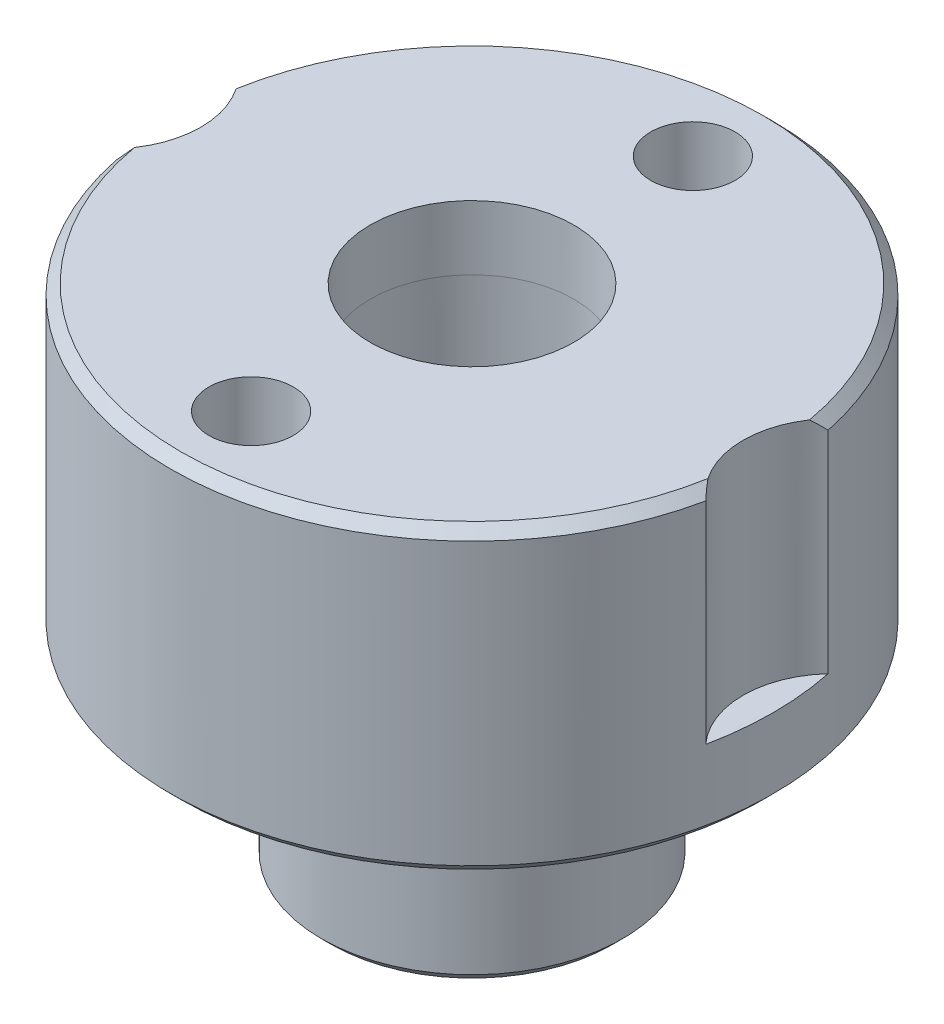
ISO-10303-21;
HEADER;
FILE_DESCRIPTION(('STEP AP214'),'2;1');
FILE_NAME('part.step','',(''),(''),'','','');
FILE_SCHEMA(('AUTOMOTIVE_DESIGN { 1 0 10303 214 1 1 1 1 }'));
ENDSEC;
DATA;
#1=APPLICATION_CONTEXT('core data for automotive mechanical design processes');
#2=APPLICATION_PROTOCOL_DEFINITION('international standard','automotive_design',2000,#1);
#3=PRODUCT_CONTEXT('',#1,'mechanical');
#4=PRODUCT('Part','Part','',(#3));
#5=PRODUCT_RELATED_PRODUCT_CATEGORY('part','',(#4));
#6=PRODUCT_DEFINITION_FORMATION('','',#4);
#7=PRODUCT_DEFINITION_CONTEXT('part definition',#1,'design');
#8=PRODUCT_DEFINITION('design','',#6,#7);
#9=PRODUCT_DEFINITION_SHAPE('','',#8);
#10=(LENGTH_UNIT() NAMED_UNIT(*) SI_UNIT(.MILLI.,.METRE.));
#11=(NAMED_UNIT(*) PLANE_ANGLE_UNIT() SI_UNIT($,.RADIAN.));
#12=(NAMED_UNIT(*) SI_UNIT($,.STERADIAN.) SOLID_ANGLE_UNIT());
#13=UNCERTAINTY_MEASURE_WITH_UNIT(LENGTH_MEASURE(1.E-05),#10,'distance_accuracy_value','');
#14=(GEOMETRIC_REPRESENTATION_CONTEXT(3) GLOBAL_UNCERTAINTY_ASSIGNED_CONTEXT((#13)) GLOBAL_UNIT_ASSIGNED_CONTEXT((#10,
#11,#12)) REPRESENTATION_CONTEXT('',''));
#15=CARTESIAN_POINT('',(0.,0.,0.));
#16=DIRECTION('',(0.,0.,1.));
#17=DIRECTION('',(1.,0.,0.));
#18=AXIS2_PLACEMENT_3D('',#15,#16,#17);
#19=CARTESIAN_POINT('',(0.,-30.,0.));
#20=DIRECTION('',(0.,-1.,0.));
#21=DIRECTION('',(0.,0.,-1.));
#22=AXIS2_PLACEMENT_3D('',#19,#20,#21);
#23=CYLINDRICAL_SURFACE('',#22,15.);
#24=CARTESIAN_POINT('',(0.,-14.5,0.));
#25=DIRECTION('',(0.,-1.,0.));
#26=DIRECTION('',(0.,0.,-1.));
#27=AXIS2_PLACEMENT_3D('',#24,#25,#26);
#28=CIRCLE('',#27,15.);
#29=CARTESIAN_POINT('',(0.,-14.5,-15.));
#30=VERTEX_POINT('',#29);
#31=EDGE_CURVE('E174',#30,#30,#28,.F.);
#32=ORIENTED_EDGE('',*,*,#31,.T.);
#33=EDGE_LOOP('',(#32));
#34=FACE_BOUND('',#33,.T.);
#35=CARTESIAN_POINT('',(0.,-11.,0.));
#36=DIRECTION('',(0.,1.,0.));
#37=DIRECTION('',(0.,0.,1.));
#38=AXIS2_PLACEMENT_3D('',#35,#36,#37);
#39=CIRCLE('',#38,15.);
#40=CARTESIAN_POINT('',(14.6875,-11.,-3.0458732327528));
#41=VERTEX_POINT('',#40);
#42=CARTESIAN_POINT('',(14.6875,-11.,3.0458732327528));
#43=VERTEX_POINT('',#42);
#44=EDGE_CURVE('E12',#41,#43,#39,.F.);
#45=ORIENTED_EDGE('',*,*,#44,.T.);
#46=DIRECTION('',(0.,1.,0.));
#47=VECTOR('',#46,1.);
#48=CARTESIAN_POINT('',(14.6875,-5.5,3.0458732327528));
#49=LINE('',#48,#47);
#50=CARTESIAN_POINT('',(14.6875,-0.499999999999997,3.0458732327528));
#51=VERTEX_POINT('',#50);
#52=EDGE_CURVE('E146',#43,#51,#49,.T.);
#53=ORIENTED_EDGE('',*,*,#52,.T.);
#54=CARTESIAN_POINT('',(0.,-0.499999999999997,0.));
#55=DIRECTION('',(0.,1.,0.));
#56=DIRECTION('',(0.,0.,1.));
#57=AXIS2_PLACEMENT_3D('',#54,#55,#56);
#58=CIRCLE('',#57,15.);
#59=CARTESIAN_POINT('',(-14.6875,-0.499999999999997,3.0458732327528));
#60=VERTEX_POINT('',#59);
#61=EDGE_CURVE('E80',#51,#60,#58,.F.);
#62=ORIENTED_EDGE('',*,*,#61,.T.);
#63=DIRECTION('',(0.,1.,0.));
#64=VECTOR('',#63,1.);
#65=CARTESIAN_POINT('',(-14.6875,-5.5,3.0458732327528));
#66=LINE('',#65,#64);
#67=CARTESIAN_POINT('',(-14.6875,-11.,3.0458732327528));
#68=VERTEX_POINT('',#67);
#69=EDGE_CURVE('E160',#68,#60,#66,.T.);
#70=ORIENTED_EDGE('',*,*,#69,.F.);
#71=CARTESIAN_POINT('',(0.,-11.,0.));
#72=DIRECTION('',(0.,1.,0.));
#73=DIRECTION('',(0.,0.,1.));
#74=AXIS2_PLACEMENT_3D('',#71,#72,#73);
#75=CIRCLE('',#74,15.);
#76=CARTESIAN_POINT('',(-14.6875,-11.,-3.0458732327528));
#77=VERTEX_POINT('',#76);
#78=EDGE_CURVE('E480',#68,#77,#75,.F.);
#79=ORIENTED_EDGE('',*,*,#78,.T.);
#80=DIRECTION('',(0.,1.,0.));
#81=VECTOR('',#80,1.);
#82=CARTESIAN_POINT('',(-14.6875,-5.5,-3.0458732327528));
#83=LINE('',#82,#81);
#84=CARTESIAN_POINT('',(-14.6875,-0.499999999999997,-3.0458732327528));
#85=VERTEX_POINT('',#84);
#86=EDGE_CURVE('E166',#85,#77,#83,.F.);
#87=ORIENTED_EDGE('',*,*,#86,.F.);
#88=CARTESIAN_POINT('',(14.6875,-0.499999999999997,-3.0458732327528));
#89=VERTEX_POINT('',#88);
#90=EDGE_CURVE('E178',#85,#89,#58,.F.);
#91=ORIENTED_EDGE('',*,*,#90,.T.);
#92=DIRECTION('',(0.,1.,0.));
#93=VECTOR('',#92,1.);
#94=CARTESIAN_POINT('',(14.6875,-5.5,-3.0458732327528));
#95=LINE('',#94,#93);
#96=EDGE_CURVE('E151',#89,#41,#95,.F.);
#97=ORIENTED_EDGE('',*,*,#96,.T.);
#98=EDGE_LOOP('',(#45,#53,#62,#70,#79,#87,#91,#97));
#99=FACE_BOUND('',#98,.T.);
#100=ADVANCED_FACE('F56',(#34,#99),#23,.T.);
#101=CARTESIAN_POINT('',(0.,-0.499999999999997,0.));
#102=DIRECTION('',(0.,-1.,0.));
#103=DIRECTION('',(0.,0.,-1.));
#104=AXIS2_PLACEMENT_3D('',#101,#102,#103);
#105=CONICAL_SURFACE('',#104,15.,0.78539816339745);
#106=CARTESIAN_POINT('',(0.,0.,0.));
#107=DIRECTION('',(0.,1.,0.));
#108=DIRECTION('',(0.,0.,1.));
#109=AXIS2_PLACEMENT_3D('',#106,#107,#108);
#110=CIRCLE('',#109,14.5);
#111=CARTESIAN_POINT('',(14.2777777777778,0.,-2.52884592816468));
#112=VERTEX_POINT('',#111);
#113=CARTESIAN_POINT('',(-14.2777777777778,0.,-2.52884592816468));
#114=VERTEX_POINT('',#113);
#115=EDGE_CURVE('E182',#112,#114,#110,.T.);
#116=ORIENTED_EDGE('',*,*,#115,.F.);
#117=CARTESIAN_POINT('',(13.5511511980912,0.931969813886579,-0.676568058479772));
#118=CARTESIAN_POINT('',(13.5634643567552,0.915636171933556,-0.757574481968815));
#119=CARTESIAN_POINT('',(13.5779090643066,0.896500953198037,-0.837630830986832));
#120=CARTESIAN_POINT('',(13.6107385904339,0.853129671061134,-0.995418510300328));
#121=CARTESIAN_POINT('',(13.6291185128826,0.828899946823268,-1.07315259420146));
#122=CARTESIAN_POINT('',(13.6894263905324,0.749650302760597,-1.3013768528385));
#123=CARTESIAN_POINT('',(13.7367180374857,0.687808263959896,-1.44812200182618));
#124=CARTESIAN_POINT('',(13.8556332788393,0.533611086976016,-1.76322257344647));
#125=CARTESIAN_POINT('',(13.9303648116627,0.437499506429673,-1.92851540416631));
#126=CARTESIAN_POINT('',(14.0940549631574,0.229512231417881,-2.24163092773213));
#127=CARTESIAN_POINT('',(14.1830523419136,0.117593691104493,-2.389404060554));
#128=CARTESIAN_POINT('',(14.3413550323485,-0.0789258417330526,-2.62243570683839));
#129=CARTESIAN_POINT('',(14.4076224868073,-0.160539069861801,-2.71236996744457));
#130=CARTESIAN_POINT('',(14.5445036765087,-0.327646422921228,-2.88472521095286));
#131=CARTESIAN_POINT('',(14.6151116058828,-0.413135325162234,-2.9671558795281));
#132=CARTESIAN_POINT('',(14.7802251617747,-0.611268407535485,-3.14670542671287));
#133=CARTESIAN_POINT('',(14.8759524397668,-0.724901244009986,-3.24160824866751));
#134=CARTESIAN_POINT('',(15.0729363162543,-0.956037308050335,-3.42052749937075));
#135=CARTESIAN_POINT('',(15.1741971503868,-1.07354347234901,-3.50453541794373));
#136=CARTESIAN_POINT('',(15.3817550076224,-1.31162110181701,-3.66221721244823));
#137=CARTESIAN_POINT('',(15.4880637545583,-1.43219936779757,-3.73586528231338));
#138=CARTESIAN_POINT('',(15.7047759870346,-1.67519014186909,-3.87276208876477));
#139=CARTESIAN_POINT('',(15.8151731520007,-1.79759965749774,-3.93602611853639));
#140=CARTESIAN_POINT('',(15.9274181971431,-1.92062894949986,-3.99429651759439));
#141=B_SPLINE_CURVE_WITH_KNOTS('',3,(#117,#118,#119,#120,#121,#122,#123,#124,#125,#126,#127,
#128,#129,#130,#131,#132,#133,#134,#135,#136,#137,#138,#139,#140),.UNSPECIFIED.,.F.,.F.,(4,2,2,
2,2,2,2,2,2,2,2,4),(0.,0.250470628007496,0.500631417107516,0.997170153748097,1.61078253629333,
2.22609126976455,2.64082242783173,3.05501042396576,3.58339005941083,4.11217996581172,
4.64226459081014,5.17156138480374),.UNSPECIFIED.);
#142=EDGE_CURVE('E65',#112,#89,#141,.T.);
#143=ORIENTED_EDGE('',*,*,#142,.T.);
#144=ORIENTED_EDGE('',*,*,#90,.F.);
#145=CARTESIAN_POINT('',(-13.5511511980912,0.931969813886579,-0.676568058479772));
#146=CARTESIAN_POINT('',(-13.5634643567552,0.915636171933556,-0.757574481968815));
#147=CARTESIAN_POINT('',(-13.5779090643066,0.896500953198037,-0.837630830986832));
#148=CARTESIAN_POINT('',(-13.6107385904339,0.853129671061134,-0.995418510300328));
#149=CARTESIAN_POINT('',(-13.6291185128826,0.828899946823268,-1.07315259420146));
#150=CARTESIAN_POINT('',(-13.6894263905324,0.749650302760597,-1.3013768528385));
#151=CARTESIAN_POINT('',(-13.7367180374857,0.687808263959896,-1.44812200182618));
#152=CARTESIAN_POINT('',(-13.8556332788393,0.533611086976016,-1.76322257344647));
#153=CARTESIAN_POINT('',(-13.9303648116627,0.437499506429673,-1.92851540416631));
#154=CARTESIAN_POINT('',(-14.0940549631574,0.229512231417881,-2.24163092773213));
#155=CARTESIAN_POINT('',(-14.1830523419136,0.117593691104493,-2.389404060554));
#156=CARTESIAN_POINT('',(-14.3413550323485,-0.0789258417330526,-2.62243570683839));
#157=CARTESIAN_POINT('',(-14.4076224868073,-0.160539069861801,-2.71236996744457));
#158=CARTESIAN_POINT('',(-14.5445036765087,-0.327646422921228,-2.88472521095286));
#159=CARTESIAN_POINT('',(-14.6151116058828,-0.413135325162234,-2.9671558795281));
#160=CARTESIAN_POINT('',(-14.7802251617747,-0.611268407535485,-3.14670542671287));
#161=CARTESIAN_POINT('',(-14.8759524397668,-0.724901244009986,-3.24160824866751));
#162=CARTESIAN_POINT('',(-15.0729363162543,-0.956037308050335,-3.42052749937075));
#163=CARTESIAN_POINT('',(-15.1741971503868,-1.07354347234901,-3.50453541794373));
#164=CARTESIAN_POINT('',(-15.3817550076224,-1.31162110181701,-3.66221721244823));
#165=CARTESIAN_POINT('',(-15.4880637545583,-1.43219936779757,-3.73586528231338));
#166=CARTESIAN_POINT('',(-15.7047759870346,-1.67519014186909,-3.87276208876477));
#167=CARTESIAN_POINT('',(-15.8151731520007,-1.79759965749774,-3.93602611853639));
#168=CARTESIAN_POINT('',(-15.9274181971431,-1.92062894949986,-3.99429651759439));
#169=B_SPLINE_CURVE_WITH_KNOTS('',3,(#145,#146,#147,#148,#149,#150,#151,#152,#153,#154,#155,
#156,#157,#158,#159,#160,#161,#162,#163,#164,#165,#166,#167,#168),.UNSPECIFIED.,.F.,.F.,(4,2,2,
2,2,2,2,2,2,2,2,4),(0.,0.250470628007496,0.500631417107516,0.997170153748097,1.61078253629333,
2.22609126976455,2.64082242783173,3.05501042396576,3.58339005941083,4.11217996581172,
4.64226459081014,5.17156138480374),.UNSPECIFIED.);
#170=EDGE_CURVE('E223',#114,#85,#169,.T.);
#171=ORIENTED_EDGE('',*,*,#170,.F.);
#172=EDGE_LOOP('',(#116,#143,#144,#171));
#173=FACE_BOUND('',#172,.T.);
#174=ADVANCED_FACE('F230',(#173),#105,.T.);
#175=ORIENTED_EDGE('',*,*,#61,.F.);
#176=CARTESIAN_POINT('',(15.9274181971431,-1.92062894949986,3.99429651759439));
#177=CARTESIAN_POINT('',(15.8151391770498,-1.79756242700524,3.93600845480786));
#178=CARTESIAN_POINT('',(15.7047091383145,-1.67511602551781,3.87272376150838));
#179=CARTESIAN_POINT('',(15.4879341317753,-1.43205319223518,3.73577947454929));
#180=CARTESIAN_POINT('',(15.3815954772873,-1.31143974968795,3.66210460572745));
#181=CARTESIAN_POINT('',(15.1740436320855,-1.07336574381338,3.50441021928915));
#182=CARTESIAN_POINT('',(15.0728158250321,-0.955896700850346,3.42042287286027));
#183=CARTESIAN_POINT('',(14.8758948698553,-0.724832919435376,3.24155114076761));
#184=CARTESIAN_POINT('',(14.7801975002499,-0.611235253812405,3.14667523623965));
#185=CARTESIAN_POINT('',(14.6151241418352,-0.413150337038716,2.96716959812365));
#186=CARTESIAN_POINT('',(14.5445278585805,-0.327675604368611,2.8847537689095));
#187=CARTESIAN_POINT('',(14.4076461605597,-0.160568314628365,2.71240166678912));
#188=CARTESIAN_POINT('',(14.3413681022321,-0.0789423764248312,2.6224531277061));
#189=CARTESIAN_POINT('',(14.1773508839428,0.124672060506971,2.38101401175403));
#190=CARTESIAN_POINT('',(14.0833349009698,0.243000837595556,2.22378264757495));
#191=CARTESIAN_POINT('',(13.9116193407276,0.46147468392248,1.88951811195754));
#192=CARTESIAN_POINT('',(13.8338682956064,0.561676971167697,1.7125502051656));
#193=CARTESIAN_POINT('',(13.7189398149479,0.711029560182719,1.39363074434549));
#194=CARTESIAN_POINT('',(13.6765474378601,0.766538478487937,1.25658807921812));
#195=CARTESIAN_POINT('',(13.6222087374818,0.838005698722258,1.04419231480573));
#196=CARTESIAN_POINT('',(13.6055977020494,0.859915230806023,0.972002703497835));
#197=CARTESIAN_POINT('',(13.5757641203292,0.899342283050529,0.825668211366334));
#198=CARTESIAN_POINT('',(13.5625451497636,0.916855168098273,0.751521357364899));
#199=CARTESIAN_POINT('',(13.5511511980912,0.931969813886577,0.67656805847977));
#200=B_SPLINE_CURVE_WITH_KNOTS('',3,(#176,#177,#178,#179,#180,#181,#182,#183,#184,#185,#186,
#187,#188,#189,#190,#191,#192,#193,#194,#195,#196,#197,#198,#199),.UNSPECIFIED.,.F.,.F.,(4,2,2,
2,2,2,2,2,2,2,2,4),(0.,0.52945701850693,1.05970069607541,1.58833034087367,2.11655099350863,
2.53066658474911,2.94547014191151,3.59785709057312,4.24814734688856,4.7081284416125,
4.93966919830503,5.17145303863089),.UNSPECIFIED.);
#201=CARTESIAN_POINT('',(14.2777777777778,0.,2.52884592816468));
#202=VERTEX_POINT('',#201);
#203=EDGE_CURVE('E484',#51,#202,#200,.T.);
#204=ORIENTED_EDGE('',*,*,#203,.T.);
#205=CARTESIAN_POINT('',(-14.2777777777778,0.,2.52884592816468));
#206=VERTEX_POINT('',#205);
#207=EDGE_CURVE('E183',#206,#202,#110,.T.);
#208=ORIENTED_EDGE('',*,*,#207,.F.);
#209=CARTESIAN_POINT('',(-15.9274181971431,-1.92062894949986,3.99429651759439));
#210=CARTESIAN_POINT('',(-15.8151391770498,-1.79756242700524,3.93600845480786));
#211=CARTESIAN_POINT('',(-15.7047091383145,-1.67511602551781,3.87272376150838));
#212=CARTESIAN_POINT('',(-15.4879341317753,-1.43205319223518,3.73577947454929));
#213=CARTESIAN_POINT('',(-15.3815954772873,-1.31143974968795,3.66210460572745));
#214=CARTESIAN_POINT('',(-15.1740436320855,-1.07336574381338,3.50441021928915));
#215=CARTESIAN_POINT('',(-15.0728158250321,-0.955896700850346,3.42042287286027));
#216=CARTESIAN_POINT('',(-14.8758948698553,-0.724832919435376,3.24155114076761));
#217=CARTESIAN_POINT('',(-14.7801975002499,-0.611235253812405,3.14667523623965));
#218=CARTESIAN_POINT('',(-14.6151241418352,-0.413150337038716,2.96716959812365));
#219=CARTESIAN_POINT('',(-14.5445278585805,-0.327675604368611,2.8847537689095));
#220=CARTESIAN_POINT('',(-14.4076461605597,-0.160568314628365,2.71240166678912));
#221=CARTESIAN_POINT('',(-14.3413681022321,-0.0789423764248312,2.6224531277061));
#222=CARTESIAN_POINT('',(-14.1773508839428,0.124672060506971,2.38101401175403));
#223=CARTESIAN_POINT('',(-14.0833349009698,0.243000837595556,2.22378264757495));
#224=CARTESIAN_POINT('',(-13.9116193407276,0.46147468392248,1.88951811195754));
#225=CARTESIAN_POINT('',(-13.8338682956064,0.561676971167697,1.7125502051656));
#226=CARTESIAN_POINT('',(-13.7189398149479,0.711029560182719,1.39363074434549));
#227=CARTESIAN_POINT('',(-13.6765474378601,0.766538478487937,1.25658807921812));
#228=CARTESIAN_POINT('',(-13.6222087374818,0.838005698722258,1.04419231480573));
#229=CARTESIAN_POINT('',(-13.6055977020494,0.859915230806023,0.972002703497835));
#230=CARTESIAN_POINT('',(-13.5757641203292,0.899342283050529,0.825668211366334));
#231=CARTESIAN_POINT('',(-13.5625451497636,0.916855168098273,0.751521357364899));
#232=CARTESIAN_POINT('',(-13.5511511980912,0.931969813886577,0.67656805847977));
#233=B_SPLINE_CURVE_WITH_KNOTS('',3,(#209,#210,#211,#212,#213,#214,#215,#216,#217,#218,#219,
#220,#221,#222,#223,#224,#225,#226,#227,#228,#229,#230,#231,#232),.UNSPECIFIED.,.F.,.F.,(4,2,2,
2,2,2,2,2,2,2,2,4),(0.,0.52945701850693,1.05970069607541,1.58833034087367,2.11655099350863,
2.53066658474911,2.94547014191151,3.59785709057312,4.24814734688856,4.7081284416125,
4.93966919830503,5.17145303863089),.UNSPECIFIED.);
#234=EDGE_CURVE('E211',#60,#206,#233,.T.);
#235=ORIENTED_EDGE('',*,*,#234,.F.);
#236=EDGE_LOOP('',(#175,#204,#208,#235));
#237=FACE_BOUND('',#236,.T.);
#238=ADVANCED_FACE('F248',(#237),#105,.T.);
#239=CARTESIAN_POINT('',(0.,-25.,0.));
#240=DIRECTION('',(0.,1.,0.));
#241=DIRECTION('',(-1.,0.,0.));
#242=AXIS2_PLACEMENT_3D('',#239,#240,#241);
#243=CYLINDRICAL_SURFACE('',#242,5.07);
#244=CARTESIAN_POINT('',(0.,0.,0.));
#245=DIRECTION('',(0.,1.,0.));
#246=DIRECTION('',(-1.,0.,0.));
#247=AXIS2_PLACEMENT_3D('',#244,#245,#246);
#248=CIRCLE('',#247,5.07);
#249=CARTESIAN_POINT('',(-5.07,0.,0.));
#250=VERTEX_POINT('',#249);
#251=EDGE_CURVE('E169',#250,#250,#248,.T.);
#252=ORIENTED_EDGE('',*,*,#251,.T.);
#253=EDGE_LOOP('',(#252));
#254=FACE_BOUND('',#253,.T.);
#255=CARTESIAN_POINT('',(0.,-3.2,0.));
#256=DIRECTION('',(0.,-1.,0.));
#257=DIRECTION('',(0.,0.,1.));
#258=AXIS2_PLACEMENT_3D('',#255,#256,#257);
#259=CIRCLE('',#258,5.07);
#260=CARTESIAN_POINT('',(0.,-3.2,5.07));
#261=VERTEX_POINT('',#260);
#262=EDGE_CURVE('E207',#261,#261,#259,.T.);
#263=ORIENTED_EDGE('',*,*,#262,.T.);
#264=EDGE_LOOP('',(#263));
#265=FACE_BOUND('',#264,.T.);
#266=ADVANCED_FACE('F243',(#254,#265),#243,.F.);
#267=CARTESIAN_POINT('',(0.,0.,0.));
#268=DIRECTION('',(0.,1.,0.));
#269=DIRECTION('',(0.,0.,1.));
#270=AXIS2_PLACEMENT_3D('',#267,#268,#269);
#271=PLANE('',#270);
#272=CARTESIAN_POINT('',(0.,0.,-11.));
#273=DIRECTION('',(0.,1.,0.));
#274=DIRECTION('',(0.,0.,1.));
#275=AXIS2_PLACEMENT_3D('',#272,#273,#274);
#276=CIRCLE('',#275,2.09999999999999);
#277=CARTESIAN_POINT('',(0.,0.,-8.90000000000001));
#278=VERTEX_POINT('',#277);
#279=EDGE_CURVE('E128',#278,#278,#276,.T.);
#280=ORIENTED_EDGE('',*,*,#279,.F.);
#281=EDGE_LOOP('',(#280));
#282=FACE_BOUND('',#281,.T.);
#283=CARTESIAN_POINT('',(0.,0.,11.));
#284=DIRECTION('',(0.,1.,0.));
#285=DIRECTION('',(0.,0.,1.));
#286=AXIS2_PLACEMENT_3D('',#283,#284,#285);
#287=CIRCLE('',#286,2.09999999999999);
#288=CARTESIAN_POINT('',(0.,0.,13.1));
#289=VERTEX_POINT('',#288);
#290=EDGE_CURVE('E127',#289,#289,#287,.T.);
#291=ORIENTED_EDGE('',*,*,#290,.F.);
#292=EDGE_LOOP('',(#291));
#293=FACE_BOUND('',#292,.T.);
#294=ORIENTED_EDGE('',*,*,#207,.T.);
#295=CARTESIAN_POINT('',(18.,0.,0.));
#296=DIRECTION('',(0.,-1.,0.));
#297=DIRECTION('',(0.,0.,1.));
#298=AXIS2_PLACEMENT_3D('',#295,#296,#297);
#299=CIRCLE('',#298,4.5);
#300=EDGE_CURVE('E72',#202,#112,#299,.T.);
#301=ORIENTED_EDGE('',*,*,#300,.T.);
#302=ORIENTED_EDGE('',*,*,#115,.T.);
#303=CARTESIAN_POINT('',(-18.,0.,0.));
#304=DIRECTION('',(0.,1.,0.));
#305=DIRECTION('',(0.,0.,1.));
#306=AXIS2_PLACEMENT_3D('',#303,#304,#305);
#307=CIRCLE('',#306,4.5);
#308=EDGE_CURVE('E155',#206,#114,#307,.T.);
#309=ORIENTED_EDGE('',*,*,#308,.F.);
#310=EDGE_LOOP('',(#294,#301,#302,#309));
#311=FACE_BOUND('',#310,.T.);
#312=ORIENTED_EDGE('',*,*,#251,.F.);
#313=EDGE_LOOP('',(#312));
#314=FACE_BOUND('',#313,.T.);
#315=ADVANCED_FACE('F247',(#282,#293,#311,#314),#271,.T.);
#316=CARTESIAN_POINT('',(15.,-15.,0.));
#317=DIRECTION('',(0.,-1.,0.));
#318=DIRECTION('',(0.,0.,-1.));
#319=AXIS2_PLACEMENT_3D('',#316,#317,#318);
#320=PLANE('',#319);
#321=CARTESIAN_POINT('',(0.,-15.,0.));
#322=DIRECTION('',(0.,-1.,0.));
#323=DIRECTION('',(0.,0.,-1.));
#324=AXIS2_PLACEMENT_3D('',#321,#322,#323);
#325=CIRCLE('',#324,7.7);
#326=CARTESIAN_POINT('',(0.,-15.,-7.7));
#327=VERTEX_POINT('',#326);
#328=EDGE_CURVE('E203',#327,#327,#325,.F.);
#329=ORIENTED_EDGE('',*,*,#328,.T.);
#330=EDGE_LOOP('',(#329));
#331=FACE_BOUND('',#330,.T.);
#332=CARTESIAN_POINT('',(0.,-15.,0.));
#333=DIRECTION('',(0.,-1.,0.));
#334=DIRECTION('',(0.,0.,-1.));
#335=AXIS2_PLACEMENT_3D('',#332,#333,#334);
#336=CIRCLE('',#335,14.5);
#337=CARTESIAN_POINT('',(0.,-15.,-14.5));
#338=VERTEX_POINT('',#337);
#339=EDGE_CURVE('E187',#338,#338,#336,.T.);
#340=ORIENTED_EDGE('',*,*,#339,.T.);
#341=EDGE_LOOP('',(#340));
#342=FACE_BOUND('',#341,.T.);
#343=ADVANCED_FACE('F257',(#331,#342),#320,.T.);
#344=CARTESIAN_POINT('',(0.,-30.,0.));
#345=DIRECTION('',(0.,-1.,0.));
#346=DIRECTION('',(0.,0.,-1.));
#347=AXIS2_PLACEMENT_3D('',#344,#345,#346);
#348=CYLINDRICAL_SURFACE('',#347,7.5);
#349=CARTESIAN_POINT('',(0.,-15.2,0.));
#350=DIRECTION('',(0.,-1.,0.));
#351=DIRECTION('',(0.,0.,-1.));
#352=AXIS2_PLACEMENT_3D('',#349,#350,#351);
#353=CIRCLE('',#352,7.5);
#354=CARTESIAN_POINT('',(0.,-15.2,-7.5));
#355=VERTEX_POINT('',#354);
#356=EDGE_CURVE('E199',#355,#355,#353,.T.);
#357=ORIENTED_EDGE('',*,*,#356,.T.);
#358=EDGE_LOOP('',(#357));
#359=FACE_BOUND('',#358,.T.);
#360=CARTESIAN_POINT('',(0.,-24.5,0.));
#361=DIRECTION('',(0.,-1.,0.));
#362=DIRECTION('',(0.,0.,-1.));
#363=AXIS2_PLACEMENT_3D('',#360,#361,#362);
#364=CIRCLE('',#363,7.5);
#365=CARTESIAN_POINT('',(0.,-24.5,-7.5));
#366=VERTEX_POINT('',#365);
#367=EDGE_CURVE('E195',#366,#366,#364,.F.);
#368=ORIENTED_EDGE('',*,*,#367,.T.);
#369=EDGE_LOOP('',(#368));
#370=FACE_BOUND('',#369,.T.);
#371=ADVANCED_FACE('F253',(#359,#370),#348,.T.);
#372=CARTESIAN_POINT('',(7.5,-25.,0.));
#373=DIRECTION('',(0.,-1.,0.));
#374=DIRECTION('',(0.,0.,-1.));
#375=AXIS2_PLACEMENT_3D('',#372,#373,#374);
#376=PLANE('',#375);
#377=CARTESIAN_POINT('',(0.,-25.,0.));
#378=DIRECTION('',(0.,-1.,0.));
#379=DIRECTION('',(0.,0.,-1.));
#380=AXIS2_PLACEMENT_3D('',#377,#378,#379);
#381=CIRCLE('',#380,7.);
#382=CARTESIAN_POINT('',(0.,-25.,-7.));
#383=VERTEX_POINT('',#382);
#384=EDGE_CURVE('E191',#383,#383,#381,.T.);
#385=ORIENTED_EDGE('',*,*,#384,.T.);
#386=EDGE_LOOP('',(#385));
#387=FACE_BOUND('',#386,.T.);
#388=CARTESIAN_POINT('',(0.,-25.,0.));
#389=DIRECTION('',(0.,-1.,0.));
#390=DIRECTION('',(0.,0.,-1.));
#391=AXIS2_PLACEMENT_3D('',#388,#389,#390);
#392=CIRCLE('',#391,5.45052041543514);
#393=CARTESIAN_POINT('',(0.,-25.,-5.45052041543514));
#394=VERTEX_POINT('',#393);
#395=EDGE_CURVE('E173',#394,#394,#392,.F.);
#396=ORIENTED_EDGE('',*,*,#395,.T.);
#397=EDGE_LOOP('',(#396));
#398=FACE_BOUND('',#397,.T.);
#399=ADVANCED_FACE('F250',(#387,#398),#376,.T.);
#400=CARTESIAN_POINT('',(0.,-3.2,0.));
#401=DIRECTION('',(0.,-1.,0.));
#402=DIRECTION('',(0.,0.,-1.));
#403=AXIS2_PLACEMENT_3D('',#400,#401,#402);
#404=CONICAL_SURFACE('',#403,5.07,0.0174532925199433);
#405=ORIENTED_EDGE('',*,*,#262,.F.);
#406=EDGE_LOOP('',(#405));
#407=FACE_BOUND('',#406,.T.);
#408=ORIENTED_EDGE('',*,*,#395,.F.);
#409=EDGE_LOOP('',(#408));
#410=FACE_BOUND('',#409,.T.);
#411=ADVANCED_FACE('F58',(#407,#410),#404,.F.);
#412=CARTESIAN_POINT('',(0.,-15.,0.));
#413=DIRECTION('',(0.,1.,0.));
#414=DIRECTION('',(0.,0.,1.));
#415=AXIS2_PLACEMENT_3D('',#412,#413,#414);
#416=CONICAL_SURFACE('',#415,14.5,0.78539816339745);
#417=ORIENTED_EDGE('',*,*,#31,.F.);
#418=EDGE_LOOP('',(#417));
#419=FACE_BOUND('',#418,.T.);
#420=ORIENTED_EDGE('',*,*,#339,.F.);
#421=EDGE_LOOP('',(#420));
#422=FACE_BOUND('',#421,.T.);
#423=ADVANCED_FACE('F282',(#419,#422),#416,.T.);
#424=CARTESIAN_POINT('',(0.,-25.,0.));
#425=DIRECTION('',(0.,1.,0.));
#426=DIRECTION('',(0.,0.,1.));
#427=AXIS2_PLACEMENT_3D('',#424,#425,#426);
#428=CONICAL_SURFACE('',#427,7.,0.785398163397443);
#429=ORIENTED_EDGE('',*,*,#367,.F.);
#430=EDGE_LOOP('',(#429));
#431=FACE_BOUND('',#430,.T.);
#432=ORIENTED_EDGE('',*,*,#384,.F.);
#433=EDGE_LOOP('',(#432));
#434=FACE_BOUND('',#433,.T.);
#435=ADVANCED_FACE('F288',(#431,#434),#428,.T.);
#436=CARTESIAN_POINT('',(0.,-15.2,0.));
#437=DIRECTION('',(0.,-1.,0.));
#438=DIRECTION('',(0.,0.,-1.));
#439=AXIS2_PLACEMENT_3D('',#436,#437,#438);
#440=TOROIDAL_SURFACE('',#439,7.7,0.2);
#441=ORIENTED_EDGE('',*,*,#328,.F.);
#442=EDGE_LOOP('',(#441));
#443=FACE_BOUND('',#442,.T.);
#444=ORIENTED_EDGE('',*,*,#356,.F.);
#445=EDGE_LOOP('',(#444));
#446=FACE_BOUND('',#445,.T.);
#447=ADVANCED_FACE('F240',(#443,#446),#440,.F.);
#448=CARTESIAN_POINT('',(-18.,-11.,0.));
#449=DIRECTION('',(0.,1.,0.));
#450=DIRECTION('',(0.,0.,1.));
#451=AXIS2_PLACEMENT_3D('',#448,#449,#450);
#452=CYLINDRICAL_SURFACE('',#451,4.5);
#453=ORIENTED_EDGE('',*,*,#86,.T.);
#454=CARTESIAN_POINT('',(-18.,-11.,0.));
#455=DIRECTION('',(0.,1.,0.));
#456=DIRECTION('',(0.,0.,1.));
#457=AXIS2_PLACEMENT_3D('',#454,#455,#456);
#458=CIRCLE('',#457,4.5);
#459=EDGE_CURVE('E156',#68,#77,#458,.T.);
#460=ORIENTED_EDGE('',*,*,#459,.F.);
#461=ORIENTED_EDGE('',*,*,#69,.T.);
#462=ORIENTED_EDGE('',*,*,#234,.T.);
#463=ORIENTED_EDGE('',*,*,#308,.T.);
#464=ORIENTED_EDGE('',*,*,#170,.T.);
#465=EDGE_LOOP('',(#453,#460,#461,#462,#463,#464));
#466=FACE_BOUND('',#465,.T.);
#467=ADVANCED_FACE('F234',(#466),#452,.F.);
#468=CARTESIAN_POINT('',(-18.,-11.,0.));
#469=DIRECTION('',(0.,1.,0.));
#470=DIRECTION('',(0.,0.,1.));
#471=AXIS2_PLACEMENT_3D('',#468,#469,#470);
#472=PLANE('',#471);
#473=ORIENTED_EDGE('',*,*,#459,.T.);
#474=ORIENTED_EDGE('',*,*,#78,.F.);
#475=EDGE_LOOP('',(#473,#474));
#476=FACE_BOUND('',#475,.T.);
#477=ADVANCED_FACE('F239',(#476),#472,.T.);
#478=CARTESIAN_POINT('',(18.,-11.,0.));
#479=DIRECTION('',(0.,1.,0.));
#480=DIRECTION('',(0.,0.,1.));
#481=AXIS2_PLACEMENT_3D('',#478,#479,#480);
#482=CYLINDRICAL_SURFACE('',#481,4.5);
#483=ORIENTED_EDGE('',*,*,#142,.F.);
#484=ORIENTED_EDGE('',*,*,#300,.F.);
#485=ORIENTED_EDGE('',*,*,#203,.F.);
#486=ORIENTED_EDGE('',*,*,#52,.F.);
#487=CARTESIAN_POINT('',(18.,-11.,0.));
#488=DIRECTION('',(0.,-1.,0.));
#489=DIRECTION('',(0.,0.,1.));
#490=AXIS2_PLACEMENT_3D('',#487,#488,#489);
#491=CIRCLE('',#490,4.5);
#492=EDGE_CURVE('E142',#43,#41,#491,.T.);
#493=ORIENTED_EDGE('',*,*,#492,.T.);
#494=ORIENTED_EDGE('',*,*,#96,.F.);
#495=EDGE_LOOP('',(#483,#484,#485,#486,#493,#494));
#496=FACE_BOUND('',#495,.T.);
#497=ADVANCED_FACE('F428',(#496),#482,.F.);
#498=CARTESIAN_POINT('',(18.,-11.,0.));
#499=DIRECTION('',(0.,1.,0.));
#500=DIRECTION('',(0.,0.,1.));
#501=AXIS2_PLACEMENT_3D('',#498,#499,#500);
#502=PLANE('',#501);
#503=ORIENTED_EDGE('',*,*,#492,.F.);
#504=ORIENTED_EDGE('',*,*,#44,.F.);
#505=EDGE_LOOP('',(#503,#504));
#506=FACE_BOUND('',#505,.T.);
#507=ADVANCED_FACE('F365',(#506),#502,.T.);
#508=CARTESIAN_POINT('',(0.,-10.,11.));
#509=DIRECTION('',(0.,1.,0.));
#510=DIRECTION('',(0.,0.,1.));
#511=AXIS2_PLACEMENT_3D('',#508,#509,#510);
#512=CONICAL_SURFACE('',#511,2.1,1.02974425867665);
#513=CARTESIAN_POINT('',(0.,-11.2618072999579,11.));
#514=VERTEX_POINT('',#513);
#515=VERTEX_LOOP('',#514);
#516=FACE_BOUND('',#515,.T.);
#517=CARTESIAN_POINT('',(0.,-10.,11.));
#518=DIRECTION('',(0.,1.,0.));
#519=DIRECTION('',(0.,0.,1.));
#520=AXIS2_PLACEMENT_3D('',#517,#518,#519);
#521=CIRCLE('',#520,2.1);
#522=CARTESIAN_POINT('',(0.,-10.,13.1));
#523=VERTEX_POINT('',#522);
#524=EDGE_CURVE('E134',#523,#523,#521,.T.);
#525=ORIENTED_EDGE('',*,*,#524,.T.);
#526=EDGE_LOOP('',(#525));
#527=FACE_BOUND('',#526,.T.);
#528=ADVANCED_FACE('F369',(#516,#527),#512,.F.);
#529=CARTESIAN_POINT('',(0.,0.,11.));
#530=DIRECTION('',(0.,1.,0.));
#531=DIRECTION('',(0.,0.,1.));
#532=AXIS2_PLACEMENT_3D('',#529,#530,#531);
#533=CYLINDRICAL_SURFACE('',#532,2.09999999999999);
#534=ORIENTED_EDGE('',*,*,#524,.F.);
#535=EDGE_LOOP('',(#534));
#536=FACE_BOUND('',#535,.T.);
#537=ORIENTED_EDGE('',*,*,#290,.T.);
#538=EDGE_LOOP('',(#537));
#539=FACE_BOUND('',#538,.T.);
#540=ADVANCED_FACE('F120',(#536,#539),#533,.F.);
#541=CARTESIAN_POINT('',(0.,-10.,-11.));
#542=DIRECTION('',(0.,1.,0.));
#543=DIRECTION('',(0.,0.,1.));
#544=AXIS2_PLACEMENT_3D('',#541,#542,#543);
#545=CONICAL_SURFACE('',#544,2.1,1.02974425867665);
#546=CARTESIAN_POINT('',(0.,-11.2618072999579,-11.));
#547=VERTEX_POINT('',#546);
#548=VERTEX_LOOP('',#547);
#549=FACE_BOUND('',#548,.T.);
#550=CARTESIAN_POINT('',(0.,-10.,-11.));
#551=DIRECTION('',(0.,1.,0.));
#552=DIRECTION('',(0.,0.,1.));
#553=AXIS2_PLACEMENT_3D('',#550,#551,#552);
#554=CIRCLE('',#553,2.1);
#555=CARTESIAN_POINT('',(0.,-10.,-8.9));
#556=VERTEX_POINT('',#555);
#557=EDGE_CURVE('E124',#556,#556,#554,.T.);
#558=ORIENTED_EDGE('',*,*,#557,.T.);
#559=EDGE_LOOP('',(#558));
#560=FACE_BOUND('',#559,.T.);
#561=ADVANCED_FACE('F116',(#549,#560),#545,.F.);
#562=CARTESIAN_POINT('',(0.,0.,-11.));
#563=DIRECTION('',(0.,1.,0.));
#564=DIRECTION('',(0.,0.,1.));
#565=AXIS2_PLACEMENT_3D('',#562,#563,#564);
#566=CYLINDRICAL_SURFACE('',#565,2.09999999999999);
#567=ORIENTED_EDGE('',*,*,#557,.F.);
#568=EDGE_LOOP('',(#567));
#569=FACE_BOUND('',#568,.T.);
#570=ORIENTED_EDGE('',*,*,#279,.T.);
#571=EDGE_LOOP('',(#570));
#572=FACE_BOUND('',#571,.T.);
#573=ADVANCED_FACE('F119',(#569,#572),#566,.F.);
#574=CLOSED_SHELL('',(#100,#174,#238,#266,#315,#343,#371,#399,#411,#423,#435,#447,#467,#477,
#497,#507,#528,#540,#561,#573));
#575=MANIFOLD_SOLID_BREP('B2',#574);
#576=ADVANCED_BREP_SHAPE_REPRESENTATION('',(#18,#575),#14);
#577=SHAPE_DEFINITION_REPRESENTATION(#9,#576);
ENDSEC;
END-ISO-10303-21;
